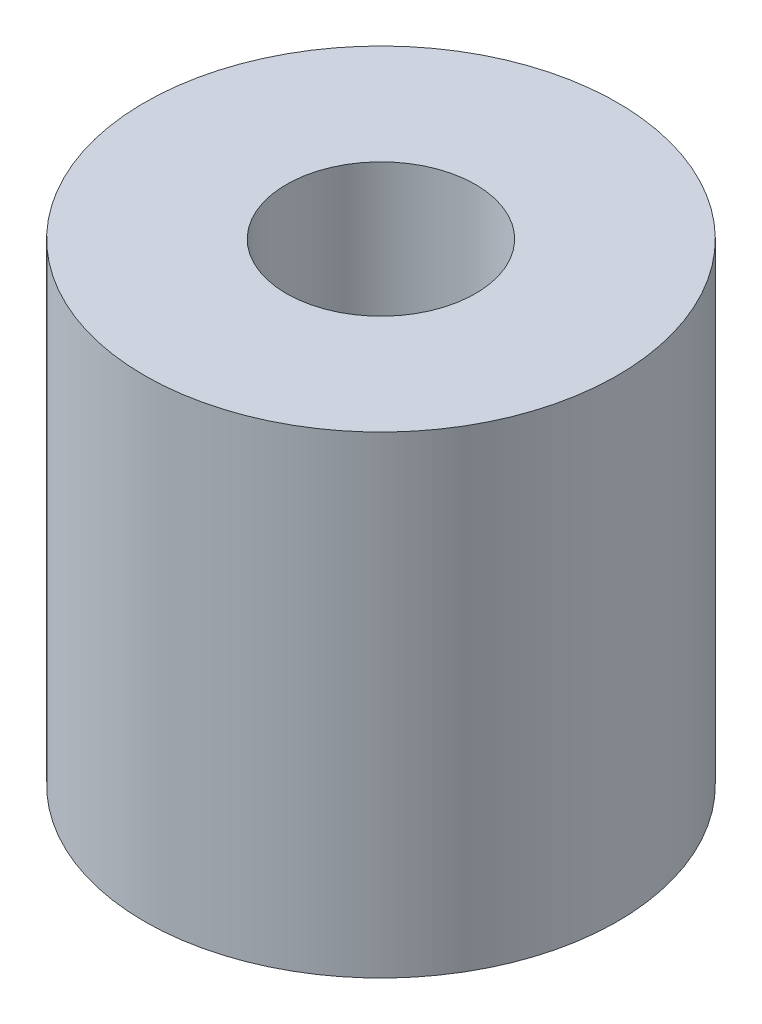
ISO-10303-21;
HEADER;
FILE_DESCRIPTION(('STEP AP214'),'2;1');
FILE_NAME('part.step','',(''),(''),'','','');
FILE_SCHEMA(('AUTOMOTIVE_DESIGN { 1 0 10303 214 1 1 1 1 }'));
ENDSEC;
DATA;
#1=APPLICATION_CONTEXT('core data for automotive mechanical design processes');
#2=APPLICATION_PROTOCOL_DEFINITION('international standard','automotive_design',2000,#1);
#3=PRODUCT_CONTEXT('',#1,'mechanical');
#4=PRODUCT('Part','Part','',(#3));
#5=PRODUCT_RELATED_PRODUCT_CATEGORY('part','',(#4));
#6=PRODUCT_DEFINITION_FORMATION('','',#4);
#7=PRODUCT_DEFINITION_CONTEXT('part definition',#1,'design');
#8=PRODUCT_DEFINITION('design','',#6,#7);
#9=PRODUCT_DEFINITION_SHAPE('','',#8);
#10=(LENGTH_UNIT() NAMED_UNIT(*) SI_UNIT(.MILLI.,.METRE.));
#11=(NAMED_UNIT(*) PLANE_ANGLE_UNIT() SI_UNIT($,.RADIAN.));
#12=(NAMED_UNIT(*) SI_UNIT($,.STERADIAN.) SOLID_ANGLE_UNIT());
#13=UNCERTAINTY_MEASURE_WITH_UNIT(LENGTH_MEASURE(1.E-05),#10,'distance_accuracy_value','');
#14=(GEOMETRIC_REPRESENTATION_CONTEXT(3) GLOBAL_UNCERTAINTY_ASSIGNED_CONTEXT((#13)) GLOBAL_UNIT_ASSIGNED_CONTEXT((#10,
#11,#12)) REPRESENTATION_CONTEXT('',''));
#15=CARTESIAN_POINT('',(0.,0.,0.));
#16=DIRECTION('',(0.,0.,1.));
#17=DIRECTION('',(1.,0.,0.));
#18=AXIS2_PLACEMENT_3D('',#15,#16,#17);
#19=CARTESIAN_POINT('',(0.,10.,0.));
#20=DIRECTION('',(0.,1.,0.));
#21=DIRECTION('',(0.,0.,1.));
#22=AXIS2_PLACEMENT_3D('',#19,#20,#21);
#23=PLANE('',#22);
#24=CARTESIAN_POINT('',(0.,10.,0.));
#25=DIRECTION('',(0.,1.,0.));
#26=DIRECTION('',(0.,0.,1.));
#27=AXIS2_PLACEMENT_3D('',#24,#25,#26);
#28=CIRCLE('',#27,5.);
#29=CARTESIAN_POINT('',(0.,10.,5.));
#30=VERTEX_POINT('',#29);
#31=EDGE_CURVE('E10',#30,#30,#28,.T.);
#32=ORIENTED_EDGE('',*,*,#31,.T.);
#33=EDGE_LOOP('',(#32));
#34=FACE_BOUND('',#33,.T.);
#35=CARTESIAN_POINT('',(0.,10.,0.));
#36=DIRECTION('',(0.,1.,0.));
#37=DIRECTION('',(0.,0.,1.));
#38=AXIS2_PLACEMENT_3D('',#35,#36,#37);
#39=CIRCLE('',#38,2.);
#40=CARTESIAN_POINT('',(0.,10.,2.));
#41=VERTEX_POINT('',#40);
#42=EDGE_CURVE('E41',#41,#41,#39,.T.);
#43=ORIENTED_EDGE('',*,*,#42,.F.);
#44=EDGE_LOOP('',(#43));
#45=FACE_BOUND('',#44,.T.);
#46=ADVANCED_FACE('F30',(#34,#45),#23,.T.);
#47=CARTESIAN_POINT('',(0.,0.,0.));
#48=DIRECTION('',(0.,1.,0.));
#49=DIRECTION('',(0.,0.,1.));
#50=AXIS2_PLACEMENT_3D('',#47,#48,#49);
#51=PLANE('',#50);
#52=CARTESIAN_POINT('',(0.,0.,0.));
#53=DIRECTION('',(0.,1.,0.));
#54=DIRECTION('',(0.,0.,1.));
#55=AXIS2_PLACEMENT_3D('',#52,#53,#54);
#56=CIRCLE('',#55,5.);
#57=CARTESIAN_POINT('',(0.,0.,5.));
#58=VERTEX_POINT('',#57);
#59=EDGE_CURVE('E34',#58,#58,#56,.T.);
#60=ORIENTED_EDGE('',*,*,#59,.F.);
#61=EDGE_LOOP('',(#60));
#62=FACE_BOUND('',#61,.T.);
#63=CARTESIAN_POINT('',(0.,0.,0.));
#64=DIRECTION('',(0.,1.,0.));
#65=DIRECTION('',(0.,0.,1.));
#66=AXIS2_PLACEMENT_3D('',#63,#64,#65);
#67=CIRCLE('',#66,2.);
#68=CARTESIAN_POINT('',(0.,0.,2.));
#69=VERTEX_POINT('',#68);
#70=EDGE_CURVE('E43',#69,#69,#67,.T.);
#71=ORIENTED_EDGE('',*,*,#70,.T.);
#72=EDGE_LOOP('',(#71));
#73=FACE_BOUND('',#72,.T.);
#74=ADVANCED_FACE('F53',(#62,#73),#51,.F.);
#75=CARTESIAN_POINT('',(0.,10.,0.));
#76=DIRECTION('',(0.,-1.,0.));
#77=DIRECTION('',(0.,0.,-1.));
#78=AXIS2_PLACEMENT_3D('',#75,#76,#77);
#79=CYLINDRICAL_SURFACE('',#78,5.);
#80=ORIENTED_EDGE('',*,*,#31,.F.);
#81=EDGE_LOOP('',(#80));
#82=FACE_BOUND('',#81,.T.);
#83=ORIENTED_EDGE('',*,*,#59,.T.);
#84=EDGE_LOOP('',(#83));
#85=FACE_BOUND('',#84,.T.);
#86=ADVANCED_FACE('F32',(#82,#85),#79,.T.);
#87=CARTESIAN_POINT('',(0.,10.,0.));
#88=DIRECTION('',(0.,-1.,0.));
#89=DIRECTION('',(0.,0.,-1.));
#90=AXIS2_PLACEMENT_3D('',#87,#88,#89);
#91=CYLINDRICAL_SURFACE('',#90,2.);
#92=ORIENTED_EDGE('',*,*,#42,.T.);
#93=EDGE_LOOP('',(#92));
#94=FACE_BOUND('',#93,.T.);
#95=ORIENTED_EDGE('',*,*,#70,.F.);
#96=EDGE_LOOP('',(#95));
#97=FACE_BOUND('',#96,.T.);
#98=ADVANCED_FACE('F49',(#94,#97),#91,.F.);
#99=CLOSED_SHELL('',(#46,#74,#86,#98));
#100=MANIFOLD_SOLID_BREP('B2',#99);
#101=ADVANCED_BREP_SHAPE_REPRESENTATION('',(#18,#100),#14);
#102=SHAPE_DEFINITION_REPRESENTATION(#9,#101);
ENDSEC;
END-ISO-10303-21;
